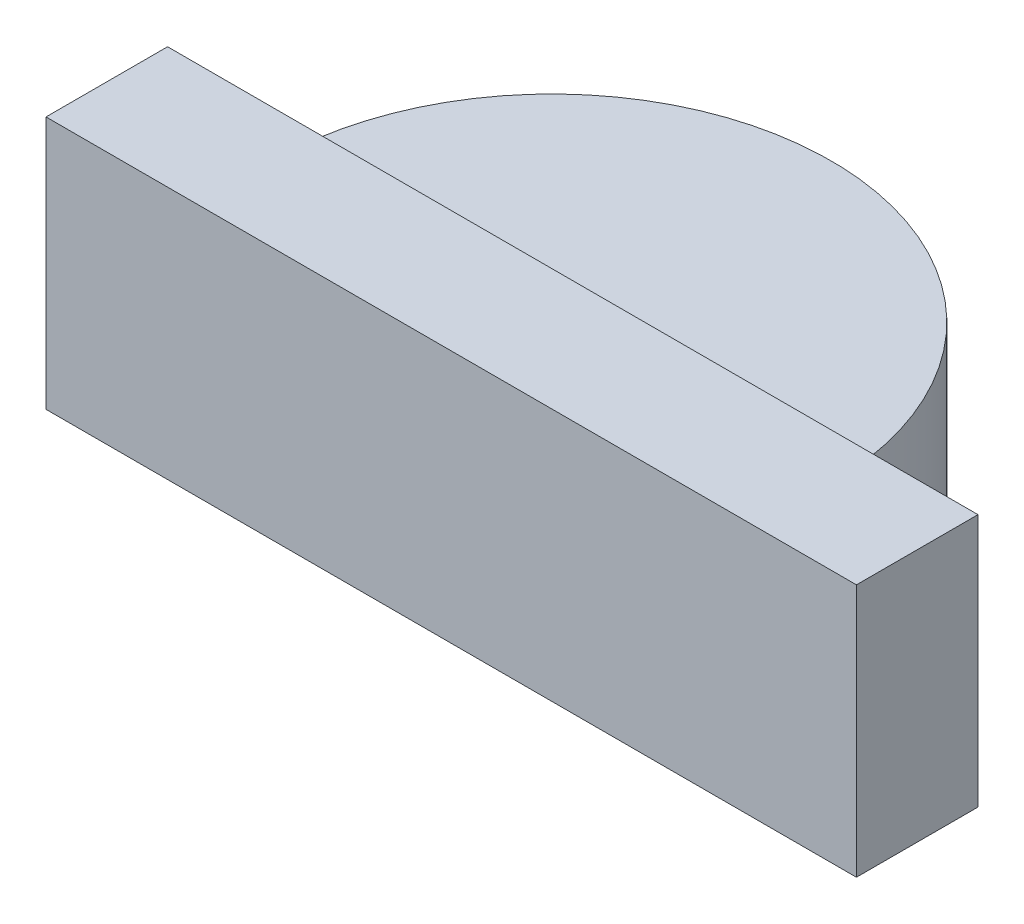
ISO-10303-21;
HEADER;
FILE_DESCRIPTION(('STEP AP214'),'2;1');
FILE_NAME('part.step','',(''),(''),'','','');
FILE_SCHEMA(('AUTOMOTIVE_DESIGN { 1 0 10303 214 1 1 1 1 }'));
ENDSEC;
DATA;
#1=APPLICATION_CONTEXT('core data for automotive mechanical design processes');
#2=APPLICATION_PROTOCOL_DEFINITION('international standard','automotive_design',2000,#1);
#3=PRODUCT_CONTEXT('',#1,'mechanical');
#4=PRODUCT('Part','Part','',(#3));
#5=PRODUCT_RELATED_PRODUCT_CATEGORY('part','',(#4));
#6=PRODUCT_DEFINITION_FORMATION('','',#4);
#7=PRODUCT_DEFINITION_CONTEXT('part definition',#1,'design');
#8=PRODUCT_DEFINITION('design','',#6,#7);
#9=PRODUCT_DEFINITION_SHAPE('','',#8);
#10=(LENGTH_UNIT() NAMED_UNIT(*) SI_UNIT(.MILLI.,.METRE.));
#11=(NAMED_UNIT(*) PLANE_ANGLE_UNIT() SI_UNIT($,.RADIAN.));
#12=(NAMED_UNIT(*) SI_UNIT($,.STERADIAN.) SOLID_ANGLE_UNIT());
#13=UNCERTAINTY_MEASURE_WITH_UNIT(LENGTH_MEASURE(1.E-05),#10,'distance_accuracy_value','');
#14=(GEOMETRIC_REPRESENTATION_CONTEXT(3) GLOBAL_UNCERTAINTY_ASSIGNED_CONTEXT((#13)) GLOBAL_UNIT_ASSIGNED_CONTEXT((#10,
#11,#12)) REPRESENTATION_CONTEXT('',''));
#15=CARTESIAN_POINT('',(0.,0.,0.));
#16=DIRECTION('',(0.,0.,1.));
#17=DIRECTION('',(1.,0.,0.));
#18=AXIS2_PLACEMENT_3D('',#15,#16,#17);
#19=CARTESIAN_POINT('',(0.,0.,0.48));
#20=DIRECTION('',(1.,0.,0.));
#21=DIRECTION('',(0.,0.,-1.));
#22=AXIS2_PLACEMENT_3D('',#19,#20,#21);
#23=PLANE('',#22);
#24=DIRECTION('',(0.,-1.,0.));
#25=VECTOR('',#24,1.);
#26=CARTESIAN_POINT('',(0.,0.,0.));
#27=LINE('',#26,#25);
#28=CARTESIAN_POINT('',(0.,1.,0.));
#29=VERTEX_POINT('',#28);
#30=CARTESIAN_POINT('',(0.,0.,0.));
#31=VERTEX_POINT('',#30);
#32=EDGE_CURVE('E110',#29,#31,#27,.T.);
#33=ORIENTED_EDGE('',*,*,#32,.T.);
#34=DIRECTION('',(0.,0.,-1.));
#35=VECTOR('',#34,1.);
#36=CARTESIAN_POINT('',(0.,0.,0.48));
#37=LINE('',#36,#35);
#38=CARTESIAN_POINT('',(0.,0.,0.48));
#39=VERTEX_POINT('',#38);
#40=EDGE_CURVE('E11',#39,#31,#37,.T.);
#41=ORIENTED_EDGE('',*,*,#40,.F.);
#42=DIRECTION('',(0.,-1.,0.));
#43=VECTOR('',#42,1.);
#44=CARTESIAN_POINT('',(0.,0.,0.48));
#45=LINE('',#44,#43);
#46=CARTESIAN_POINT('',(0.,1.,0.48));
#47=VERTEX_POINT('',#46);
#48=EDGE_CURVE('E120',#47,#39,#45,.T.);
#49=ORIENTED_EDGE('',*,*,#48,.F.);
#50=DIRECTION('',(0.,0.,-1.));
#51=VECTOR('',#50,1.);
#52=CARTESIAN_POINT('',(0.,1.,0.48));
#53=LINE('',#52,#51);
#54=EDGE_CURVE('E126',#47,#29,#53,.T.);
#55=ORIENTED_EDGE('',*,*,#54,.T.);
#56=EDGE_LOOP('',(#33,#41,#49,#55));
#57=FACE_BOUND('',#56,.T.);
#58=ADVANCED_FACE('F36',(#57),#23,.F.);
#59=CARTESIAN_POINT('',(0.,0.,0.48));
#60=DIRECTION('',(0.,1.,0.));
#61=DIRECTION('',(0.,0.,1.));
#62=AXIS2_PLACEMENT_3D('',#59,#60,#61);
#63=PLANE('',#62);
#64=DIRECTION('',(1.,0.,0.));
#65=VECTOR('',#64,1.);
#66=CARTESIAN_POINT('',(0.,0.,0.));
#67=LINE('',#66,#65);
#68=CARTESIAN_POINT('',(3.2,0.,0.));
#69=VERTEX_POINT('',#68);
#70=EDGE_CURVE('E129',#31,#69,#67,.T.);
#71=ORIENTED_EDGE('',*,*,#70,.T.);
#72=DIRECTION('',(0.,0.,-1.));
#73=VECTOR('',#72,1.);
#74=CARTESIAN_POINT('',(3.2,0.,0.48));
#75=LINE('',#74,#73);
#76=CARTESIAN_POINT('',(3.2,0.,0.48));
#77=VERTEX_POINT('',#76);
#78=EDGE_CURVE('E43',#77,#69,#75,.T.);
#79=ORIENTED_EDGE('',*,*,#78,.F.);
#80=DIRECTION('',(1.,0.,0.));
#81=VECTOR('',#80,1.);
#82=CARTESIAN_POINT('',(0.,0.,0.48));
#83=LINE('',#82,#81);
#84=EDGE_CURVE('E86',#39,#77,#83,.T.);
#85=ORIENTED_EDGE('',*,*,#84,.F.);
#86=ORIENTED_EDGE('',*,*,#40,.T.);
#87=EDGE_LOOP('',(#71,#79,#85,#86));
#88=FACE_BOUND('',#87,.T.);
#89=ADVANCED_FACE('F155',(#88),#63,.F.);
#90=CARTESIAN_POINT('',(3.2,0.,0.48));
#91=DIRECTION('',(-1.,0.,0.));
#92=DIRECTION('',(0.,0.,1.));
#93=AXIS2_PLACEMENT_3D('',#90,#91,#92);
#94=PLANE('',#93);
#95=DIRECTION('',(0.,1.,0.));
#96=VECTOR('',#95,1.);
#97=CARTESIAN_POINT('',(3.2,0.,0.));
#98=LINE('',#97,#96);
#99=CARTESIAN_POINT('',(3.2,1.,0.));
#100=VERTEX_POINT('',#99);
#101=EDGE_CURVE('E131',#69,#100,#98,.T.);
#102=ORIENTED_EDGE('',*,*,#101,.T.);
#103=DIRECTION('',(0.,0.,-1.));
#104=VECTOR('',#103,1.);
#105=CARTESIAN_POINT('',(3.2,1.,0.48));
#106=LINE('',#105,#104);
#107=CARTESIAN_POINT('',(3.2,1.,0.48));
#108=VERTEX_POINT('',#107);
#109=EDGE_CURVE('E135',#108,#100,#106,.T.);
#110=ORIENTED_EDGE('',*,*,#109,.F.);
#111=DIRECTION('',(0.,1.,0.));
#112=VECTOR('',#111,1.);
#113=CARTESIAN_POINT('',(3.2,0.,0.48));
#114=LINE('',#113,#112);
#115=EDGE_CURVE('E123',#77,#108,#114,.T.);
#116=ORIENTED_EDGE('',*,*,#115,.F.);
#117=ORIENTED_EDGE('',*,*,#78,.T.);
#118=EDGE_LOOP('',(#102,#110,#116,#117));
#119=FACE_BOUND('',#118,.T.);
#120=ADVANCED_FACE('F140',(#119),#94,.F.);
#121=CARTESIAN_POINT('',(0.,1.,0.48));
#122=DIRECTION('',(0.,-1.,0.));
#123=DIRECTION('',(0.,0.,-1.));
#124=AXIS2_PLACEMENT_3D('',#121,#122,#123);
#125=PLANE('',#124);
#126=DIRECTION('',(-1.,0.,0.));
#127=VECTOR('',#126,1.);
#128=CARTESIAN_POINT('',(0.,1.,0.));
#129=LINE('',#128,#127);
#130=EDGE_CURVE('E79',#100,#29,#129,.T.);
#131=ORIENTED_EDGE('',*,*,#130,.T.);
#132=ORIENTED_EDGE('',*,*,#54,.F.);
#133=DIRECTION('',(-1.,0.,0.));
#134=VECTOR('',#133,1.);
#135=CARTESIAN_POINT('',(0.,1.,0.48));
#136=LINE('',#135,#134);
#137=EDGE_CURVE('E58',#108,#47,#136,.T.);
#138=ORIENTED_EDGE('',*,*,#137,.F.);
#139=ORIENTED_EDGE('',*,*,#109,.T.);
#140=EDGE_LOOP('',(#131,#132,#138,#139));
#141=FACE_BOUND('',#140,.T.);
#142=ADVANCED_FACE('F146',(#141),#125,.F.);
#143=CARTESIAN_POINT('',(0.,0.,0.48));
#144=DIRECTION('',(0.,0.,-1.));
#145=DIRECTION('',(-1.,0.,0.));
#146=AXIS2_PLACEMENT_3D('',#143,#144,#145);
#147=PLANE('',#146);
#148=ORIENTED_EDGE('',*,*,#48,.T.);
#149=ORIENTED_EDGE('',*,*,#84,.T.);
#150=ORIENTED_EDGE('',*,*,#115,.T.);
#151=ORIENTED_EDGE('',*,*,#137,.T.);
#152=EDGE_LOOP('',(#148,#149,#150,#151));
#153=FACE_BOUND('',#152,.T.);
#154=ADVANCED_FACE('F148',(#153),#147,.F.);
#155=CARTESIAN_POINT('',(0.,0.,0.));
#156=DIRECTION('',(0.,0.,-1.));
#157=DIRECTION('',(-1.,0.,0.));
#158=AXIS2_PLACEMENT_3D('',#155,#156,#157);
#159=PLANE('',#158);
#160=DIRECTION('',(-1.,0.,0.));
#161=VECTOR('',#160,1.);
#162=CARTESIAN_POINT('',(0.5,0.1,0.));
#163=LINE('',#162,#161);
#164=CARTESIAN_POINT('',(2.7,0.1,0.));
#165=VERTEX_POINT('',#164);
#166=CARTESIAN_POINT('',(0.5,0.1,0.));
#167=VERTEX_POINT('',#166);
#168=EDGE_CURVE('E100',#165,#167,#163,.T.);
#169=ORIENTED_EDGE('',*,*,#168,.F.);
#170=DIRECTION('',(0.,1.,0.));
#171=VECTOR('',#170,1.);
#172=CARTESIAN_POINT('',(2.7,0.1,0.));
#173=LINE('',#172,#171);
#174=CARTESIAN_POINT('',(2.7,0.9,0.));
#175=VERTEX_POINT('',#174);
#176=EDGE_CURVE('E106',#165,#175,#173,.T.);
#177=ORIENTED_EDGE('',*,*,#176,.T.);
#178=DIRECTION('',(-1.,0.,0.));
#179=VECTOR('',#178,1.);
#180=CARTESIAN_POINT('',(0.5,0.9,0.));
#181=LINE('',#180,#179);
#182=CARTESIAN_POINT('',(0.5,0.9,0.));
#183=VERTEX_POINT('',#182);
#184=EDGE_CURVE('E103',#175,#183,#181,.T.);
#185=ORIENTED_EDGE('',*,*,#184,.T.);
#186=DIRECTION('',(0.,1.,0.));
#187=VECTOR('',#186,1.);
#188=CARTESIAN_POINT('',(0.5,0.1,0.));
#189=LINE('',#188,#187);
#190=EDGE_CURVE('E111',#167,#183,#189,.T.);
#191=ORIENTED_EDGE('',*,*,#190,.F.);
#192=EDGE_LOOP('',(#169,#177,#185,#191));
#193=FACE_BOUND('',#192,.T.);
#194=ORIENTED_EDGE('',*,*,#32,.F.);
#195=ORIENTED_EDGE('',*,*,#130,.F.);
#196=ORIENTED_EDGE('',*,*,#101,.F.);
#197=ORIENTED_EDGE('',*,*,#70,.F.);
#198=EDGE_LOOP('',(#194,#195,#196,#197));
#199=FACE_BOUND('',#198,.T.);
#200=ADVANCED_FACE('F113',(#193,#199),#159,.T.);
#201=CARTESIAN_POINT('',(1.6,0.1,0.0831372549019606));
#202=DIRECTION('',(0.,1.,0.));
#203=DIRECTION('',(0.,0.,1.));
#204=AXIS2_PLACEMENT_3D('',#201,#202,#203);
#205=CYLINDRICAL_SURFACE('',#204,1.10313725490196);
#206=CARTESIAN_POINT('',(1.6,0.9,0.0831372549019606));
#207=DIRECTION('',(0.,-1.,0.));
#208=DIRECTION('',(0.,0.,-1.));
#209=AXIS2_PLACEMENT_3D('',#206,#207,#208);
#210=CIRCLE('',#209,1.10313725490196);
#211=EDGE_CURVE('E49',#183,#175,#210,.T.);
#212=ORIENTED_EDGE('',*,*,#211,.T.);
#213=ORIENTED_EDGE('',*,*,#176,.F.);
#214=CARTESIAN_POINT('',(1.6,0.1,0.0831372549019606));
#215=DIRECTION('',(0.,-1.,0.));
#216=DIRECTION('',(0.,0.,-1.));
#217=AXIS2_PLACEMENT_3D('',#214,#215,#216);
#218=CIRCLE('',#217,1.10313725490196);
#219=EDGE_CURVE('E96',#167,#165,#218,.T.);
#220=ORIENTED_EDGE('',*,*,#219,.F.);
#221=ORIENTED_EDGE('',*,*,#190,.T.);
#222=EDGE_LOOP('',(#212,#213,#220,#221));
#223=FACE_BOUND('',#222,.T.);
#224=ADVANCED_FACE('F107',(#223),#205,.T.);
#225=CARTESIAN_POINT('',(1.6,0.1,0.0831372549019606));
#226=DIRECTION('',(0.,-1.,0.));
#227=DIRECTION('',(0.,0.,-1.));
#228=AXIS2_PLACEMENT_3D('',#225,#226,#227);
#229=PLANE('',#228);
#230=ORIENTED_EDGE('',*,*,#219,.T.);
#231=ORIENTED_EDGE('',*,*,#168,.T.);
#232=EDGE_LOOP('',(#230,#231));
#233=FACE_BOUND('',#232,.T.);
#234=ADVANCED_FACE('F98',(#233),#229,.T.);
#235=CARTESIAN_POINT('',(1.6,0.9,0.0831372549019606));
#236=DIRECTION('',(0.,-1.,0.));
#237=DIRECTION('',(0.,0.,-1.));
#238=AXIS2_PLACEMENT_3D('',#235,#236,#237);
#239=PLANE('',#238);
#240=ORIENTED_EDGE('',*,*,#211,.F.);
#241=ORIENTED_EDGE('',*,*,#184,.F.);
#242=EDGE_LOOP('',(#240,#241));
#243=FACE_BOUND('',#242,.T.);
#244=ADVANCED_FACE('F202',(#243),#239,.F.);
#245=CLOSED_SHELL('',(#58,#89,#120,#142,#154,#200,#224,#234,#244));
#246=MANIFOLD_SOLID_BREP('B2',#245);
#247=ADVANCED_BREP_SHAPE_REPRESENTATION('',(#18,#246),#14);
#248=SHAPE_DEFINITION_REPRESENTATION(#9,#247);
ENDSEC;
END-ISO-10303-21;
